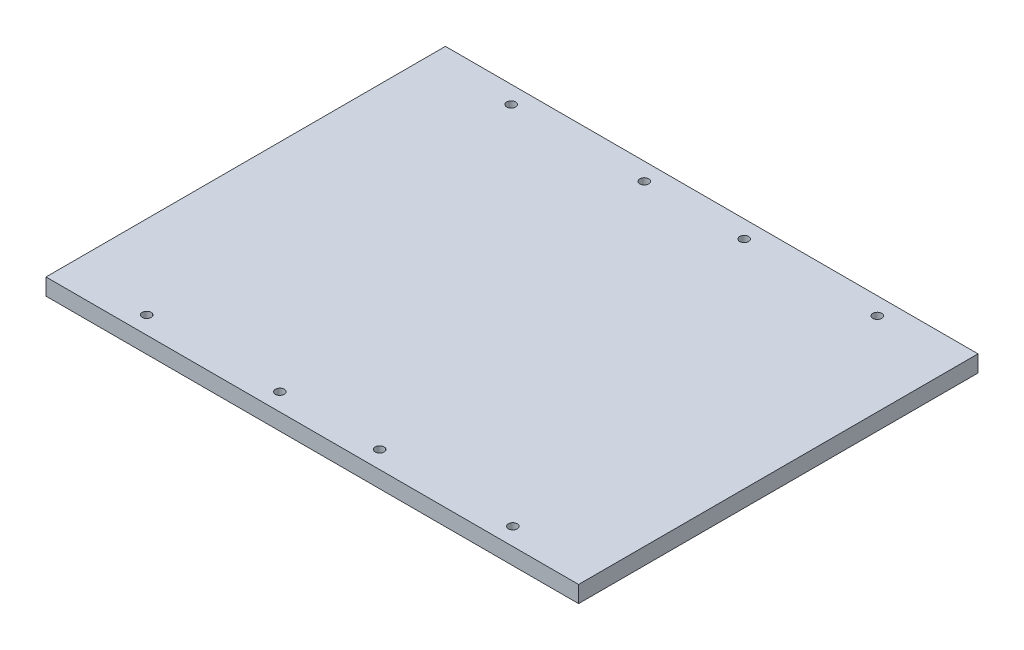
ISO-10303-21;
HEADER;
FILE_DESCRIPTION(('STEP AP214'),'2;1');
FILE_NAME('part.step','',(''),(''),'','','');
FILE_SCHEMA(('AUTOMOTIVE_DESIGN { 1 0 10303 214 1 1 1 1 }'));
ENDSEC;
DATA;
#1=APPLICATION_CONTEXT('core data for automotive mechanical design processes');
#2=APPLICATION_PROTOCOL_DEFINITION('international standard','automotive_design',2000,#1);
#3=PRODUCT_CONTEXT('',#1,'mechanical');
#4=PRODUCT('Part','Part','',(#3));
#5=PRODUCT_RELATED_PRODUCT_CATEGORY('part','',(#4));
#6=PRODUCT_DEFINITION_FORMATION('','',#4);
#7=PRODUCT_DEFINITION_CONTEXT('part definition',#1,'design');
#8=PRODUCT_DEFINITION('design','',#6,#7);
#9=PRODUCT_DEFINITION_SHAPE('','',#8);
#10=(LENGTH_UNIT() NAMED_UNIT(*) SI_UNIT(.MILLI.,.METRE.));
#11=(NAMED_UNIT(*) PLANE_ANGLE_UNIT() SI_UNIT($,.RADIAN.));
#12=(NAMED_UNIT(*) SI_UNIT($,.STERADIAN.) SOLID_ANGLE_UNIT());
#13=UNCERTAINTY_MEASURE_WITH_UNIT(LENGTH_MEASURE(1.E-05),#10,'distance_accuracy_value','');
#14=(GEOMETRIC_REPRESENTATION_CONTEXT(3) GLOBAL_UNCERTAINTY_ASSIGNED_CONTEXT((#13)) GLOBAL_UNIT_ASSIGNED_CONTEXT((#10,
#11,#12)) REPRESENTATION_CONTEXT('',''));
#15=CARTESIAN_POINT('',(0.,0.,0.));
#16=DIRECTION('',(0.,0.,1.));
#17=DIRECTION('',(1.,0.,0.));
#18=AXIS2_PLACEMENT_3D('',#15,#16,#17);
#19=CARTESIAN_POINT('',(0.,6.35,0.));
#20=DIRECTION('',(0.,1.,0.));
#21=DIRECTION('',(0.,0.,1.));
#22=AXIS2_PLACEMENT_3D('',#19,#20,#21);
#23=PLANE('',#22);
#24=CARTESIAN_POINT('',(19.0499999999987,6.35,69.5325));
#25=DIRECTION('',(0.,1.,0.));
#26=DIRECTION('',(0.,0.,-1.));
#27=AXIS2_PLACEMENT_3D('',#24,#25,#26);
#28=CIRCLE('',#27,1.70000000000061);
#29=CARTESIAN_POINT('',(19.0499999999987,6.35,67.8324999999994));
#30=VERTEX_POINT('',#29);
#31=EDGE_CURVE('E145',#30,#30,#28,.T.);
#32=ORIENTED_EDGE('',*,*,#31,.F.);
#33=EDGE_LOOP('',(#32));
#34=FACE_BOUND('',#33,.T.);
#35=CARTESIAN_POINT('',(-69.8500000000013,6.35,69.5325));
#36=DIRECTION('',(0.,1.,0.));
#37=DIRECTION('',(0.,0.,-1.));
#38=AXIS2_PLACEMENT_3D('',#35,#36,#37);
#39=CIRCLE('',#38,1.7000000000006);
#40=CARTESIAN_POINT('',(-69.8500000000013,6.35,67.8324999999994));
#41=VERTEX_POINT('',#40);
#42=EDGE_CURVE('E133',#41,#41,#39,.T.);
#43=ORIENTED_EDGE('',*,*,#42,.F.);
#44=EDGE_LOOP('',(#43));
#45=FACE_BOUND('',#44,.T.);
#46=CARTESIAN_POINT('',(19.0499999999987,6.35,-69.5325));
#47=DIRECTION('',(0.,1.,0.));
#48=DIRECTION('',(0.,0.,1.));
#49=AXIS2_PLACEMENT_3D('',#46,#47,#48);
#50=CIRCLE('',#49,1.70000000000061);
#51=CARTESIAN_POINT('',(19.0499999999987,6.35,-67.8324999999994));
#52=VERTEX_POINT('',#51);
#53=EDGE_CURVE('E121',#52,#52,#50,.T.);
#54=ORIENTED_EDGE('',*,*,#53,.F.);
#55=EDGE_LOOP('',(#54));
#56=FACE_BOUND('',#55,.T.);
#57=CARTESIAN_POINT('',(-69.8500000000013,6.35,-69.5325));
#58=DIRECTION('',(0.,1.,0.));
#59=DIRECTION('',(0.,0.,1.));
#60=AXIS2_PLACEMENT_3D('',#57,#58,#59);
#61=CIRCLE('',#60,1.7000000000006);
#62=CARTESIAN_POINT('',(-69.8500000000013,6.35,-67.8324999999994));
#63=VERTEX_POINT('',#62);
#64=EDGE_CURVE('E100',#63,#63,#61,.T.);
#65=ORIENTED_EDGE('',*,*,#64,.F.);
#66=EDGE_LOOP('',(#65));
#67=FACE_BOUND('',#66,.T.);
#68=DIRECTION('',(0.,0.,1.));
#69=VECTOR('',#68,1.);
#70=CARTESIAN_POINT('',(-101.599999999999,6.35,76.2));
#71=LINE('',#70,#69);
#72=CARTESIAN_POINT('',(-101.599999999999,6.35,-76.2));
#73=VERTEX_POINT('',#72);
#74=CARTESIAN_POINT('',(-101.599999999999,6.35,76.2));
#75=VERTEX_POINT('',#74);
#76=EDGE_CURVE('E85',#73,#75,#71,.T.);
#77=ORIENTED_EDGE('',*,*,#76,.T.);
#78=DIRECTION('',(1.,0.,0.));
#79=VECTOR('',#78,1.);
#80=CARTESIAN_POINT('',(101.600000000001,6.35,76.2));
#81=LINE('',#80,#79);
#82=CARTESIAN_POINT('',(101.600000000001,6.35,76.2));
#83=VERTEX_POINT('',#82);
#84=EDGE_CURVE('E80',#75,#83,#81,.T.);
#85=ORIENTED_EDGE('',*,*,#84,.T.);
#86=DIRECTION('',(0.,0.,-1.));
#87=VECTOR('',#86,1.);
#88=CARTESIAN_POINT('',(101.600000000001,6.35,76.2));
#89=LINE('',#88,#87);
#90=CARTESIAN_POINT('',(101.600000000001,6.35,-76.2));
#91=VERTEX_POINT('',#90);
#92=EDGE_CURVE('E83',#83,#91,#89,.T.);
#93=ORIENTED_EDGE('',*,*,#92,.T.);
#94=DIRECTION('',(-1.,0.,0.));
#95=VECTOR('',#94,1.);
#96=CARTESIAN_POINT('',(101.600000000001,6.35,-76.2));
#97=LINE('',#96,#95);
#98=EDGE_CURVE('E50',#91,#73,#97,.T.);
#99=ORIENTED_EDGE('',*,*,#98,.T.);
#100=EDGE_LOOP('',(#77,#85,#93,#99));
#101=FACE_BOUND('',#100,.T.);
#102=CARTESIAN_POINT('',(-19.0500000000013,6.35,-69.5325));
#103=DIRECTION('',(0.,1.,0.));
#104=DIRECTION('',(0.,0.,1.));
#105=AXIS2_PLACEMENT_3D('',#102,#103,#104);
#106=CIRCLE('',#105,1.70000000000061);
#107=CARTESIAN_POINT('',(-19.0500000000013,6.35,-67.8324999999994));
#108=VERTEX_POINT('',#107);
#109=EDGE_CURVE('E115',#108,#108,#106,.T.);
#110=ORIENTED_EDGE('',*,*,#109,.F.);
#111=EDGE_LOOP('',(#110));
#112=FACE_BOUND('',#111,.T.);
#113=CARTESIAN_POINT('',(69.8499999999987,6.35,-69.5325));
#114=DIRECTION('',(0.,1.,0.));
#115=DIRECTION('',(0.,0.,1.));
#116=AXIS2_PLACEMENT_3D('',#113,#114,#115);
#117=CIRCLE('',#116,1.7000000000006);
#118=CARTESIAN_POINT('',(69.8499999999987,6.35,-67.8324999999994));
#119=VERTEX_POINT('',#118);
#120=EDGE_CURVE('E127',#119,#119,#117,.T.);
#121=ORIENTED_EDGE('',*,*,#120,.F.);
#122=EDGE_LOOP('',(#121));
#123=FACE_BOUND('',#122,.T.);
#124=CARTESIAN_POINT('',(69.8499999999987,6.35,69.5325));
#125=DIRECTION('',(0.,1.,0.));
#126=DIRECTION('',(0.,0.,-1.));
#127=AXIS2_PLACEMENT_3D('',#124,#125,#126);
#128=CIRCLE('',#127,1.70000000000061);
#129=CARTESIAN_POINT('',(69.8499999999987,6.35,67.8324999999994));
#130=VERTEX_POINT('',#129);
#131=EDGE_CURVE('E139',#130,#130,#128,.T.);
#132=ORIENTED_EDGE('',*,*,#131,.F.);
#133=EDGE_LOOP('',(#132));
#134=FACE_BOUND('',#133,.T.);
#135=CARTESIAN_POINT('',(-19.0500000000013,6.35,69.5325));
#136=DIRECTION('',(0.,1.,0.));
#137=DIRECTION('',(0.,0.,-1.));
#138=AXIS2_PLACEMENT_3D('',#135,#136,#137);
#139=CIRCLE('',#138,1.70000000000061);
#140=CARTESIAN_POINT('',(-19.0500000000013,6.35,67.8324999999994));
#141=VERTEX_POINT('',#140);
#142=EDGE_CURVE('E151',#141,#141,#139,.T.);
#143=ORIENTED_EDGE('',*,*,#142,.F.);
#144=EDGE_LOOP('',(#143));
#145=FACE_BOUND('',#144,.T.);
#146=ADVANCED_FACE('F33',(#34,#45,#56,#67,#101,#112,#123,#134,#145),#23,.T.);
#147=CARTESIAN_POINT('',(0.,0.,0.));
#148=DIRECTION('',(0.,1.,0.));
#149=DIRECTION('',(0.,0.,1.));
#150=AXIS2_PLACEMENT_3D('',#147,#148,#149);
#151=PLANE('',#150);
#152=CARTESIAN_POINT('',(19.0499999999987,0.,69.5325));
#153=DIRECTION('',(0.,1.,0.));
#154=DIRECTION('',(0.,0.,-1.));
#155=AXIS2_PLACEMENT_3D('',#152,#153,#154);
#156=CIRCLE('',#155,1.70000000000061);
#157=CARTESIAN_POINT('',(19.0499999999987,0.,67.8324999999994));
#158=VERTEX_POINT('',#157);
#159=EDGE_CURVE('E148',#158,#158,#156,.T.);
#160=ORIENTED_EDGE('',*,*,#159,.T.);
#161=EDGE_LOOP('',(#160));
#162=FACE_BOUND('',#161,.T.);
#163=CARTESIAN_POINT('',(-69.8500000000013,0.,69.5325));
#164=DIRECTION('',(0.,1.,0.));
#165=DIRECTION('',(0.,0.,-1.));
#166=AXIS2_PLACEMENT_3D('',#163,#164,#165);
#167=CIRCLE('',#166,1.7000000000006);
#168=CARTESIAN_POINT('',(-69.8500000000013,0.,67.8324999999994));
#169=VERTEX_POINT('',#168);
#170=EDGE_CURVE('E136',#169,#169,#167,.T.);
#171=ORIENTED_EDGE('',*,*,#170,.T.);
#172=EDGE_LOOP('',(#171));
#173=FACE_BOUND('',#172,.T.);
#174=CARTESIAN_POINT('',(19.0499999999987,0.,-69.5325));
#175=DIRECTION('',(0.,1.,0.));
#176=DIRECTION('',(0.,0.,1.));
#177=AXIS2_PLACEMENT_3D('',#174,#175,#176);
#178=CIRCLE('',#177,1.70000000000061);
#179=CARTESIAN_POINT('',(19.0499999999987,0.,-67.8324999999994));
#180=VERTEX_POINT('',#179);
#181=EDGE_CURVE('E124',#180,#180,#178,.T.);
#182=ORIENTED_EDGE('',*,*,#181,.T.);
#183=EDGE_LOOP('',(#182));
#184=FACE_BOUND('',#183,.T.);
#185=CARTESIAN_POINT('',(-69.8500000000013,0.,-69.5325));
#186=DIRECTION('',(0.,1.,0.));
#187=DIRECTION('',(0.,0.,1.));
#188=AXIS2_PLACEMENT_3D('',#185,#186,#187);
#189=CIRCLE('',#188,1.7000000000006);
#190=CARTESIAN_POINT('',(-69.8500000000013,0.,-67.8324999999994));
#191=VERTEX_POINT('',#190);
#192=EDGE_CURVE('E112',#191,#191,#189,.T.);
#193=ORIENTED_EDGE('',*,*,#192,.T.);
#194=EDGE_LOOP('',(#193));
#195=FACE_BOUND('',#194,.T.);
#196=DIRECTION('',(0.,0.,1.));
#197=VECTOR('',#196,1.);
#198=CARTESIAN_POINT('',(-101.599999999999,0.,76.2));
#199=LINE('',#198,#197);
#200=CARTESIAN_POINT('',(-101.599999999999,0.,-76.2));
#201=VERTEX_POINT('',#200);
#202=CARTESIAN_POINT('',(-101.599999999999,0.,76.2));
#203=VERTEX_POINT('',#202);
#204=EDGE_CURVE('E97',#201,#203,#199,.T.);
#205=ORIENTED_EDGE('',*,*,#204,.F.);
#206=DIRECTION('',(-1.,0.,0.));
#207=VECTOR('',#206,1.);
#208=CARTESIAN_POINT('',(101.600000000001,0.,-76.2));
#209=LINE('',#208,#207);
#210=CARTESIAN_POINT('',(101.600000000001,0.,-76.2));
#211=VERTEX_POINT('',#210);
#212=EDGE_CURVE('E73',#211,#201,#209,.T.);
#213=ORIENTED_EDGE('',*,*,#212,.F.);
#214=DIRECTION('',(0.,0.,-1.));
#215=VECTOR('',#214,1.);
#216=CARTESIAN_POINT('',(101.600000000001,0.,76.2));
#217=LINE('',#216,#215);
#218=CARTESIAN_POINT('',(101.600000000001,0.,76.2));
#219=VERTEX_POINT('',#218);
#220=EDGE_CURVE('E67',#219,#211,#217,.T.);
#221=ORIENTED_EDGE('',*,*,#220,.F.);
#222=DIRECTION('',(1.,0.,0.));
#223=VECTOR('',#222,1.);
#224=CARTESIAN_POINT('',(101.600000000001,0.,76.2));
#225=LINE('',#224,#223);
#226=EDGE_CURVE('E89',#203,#219,#225,.T.);
#227=ORIENTED_EDGE('',*,*,#226,.F.);
#228=EDGE_LOOP('',(#205,#213,#221,#227));
#229=FACE_BOUND('',#228,.T.);
#230=CARTESIAN_POINT('',(-19.0500000000013,0.,-69.5325));
#231=DIRECTION('',(0.,1.,0.));
#232=DIRECTION('',(0.,0.,1.));
#233=AXIS2_PLACEMENT_3D('',#230,#231,#232);
#234=CIRCLE('',#233,1.70000000000061);
#235=CARTESIAN_POINT('',(-19.0500000000013,0.,-67.8324999999994));
#236=VERTEX_POINT('',#235);
#237=EDGE_CURVE('E118',#236,#236,#234,.T.);
#238=ORIENTED_EDGE('',*,*,#237,.T.);
#239=EDGE_LOOP('',(#238));
#240=FACE_BOUND('',#239,.T.);
#241=CARTESIAN_POINT('',(69.8499999999987,0.,-69.5325));
#242=DIRECTION('',(0.,1.,0.));
#243=DIRECTION('',(0.,0.,1.));
#244=AXIS2_PLACEMENT_3D('',#241,#242,#243);
#245=CIRCLE('',#244,1.7000000000006);
#246=CARTESIAN_POINT('',(69.8499999999987,0.,-67.8324999999994));
#247=VERTEX_POINT('',#246);
#248=EDGE_CURVE('E130',#247,#247,#245,.T.);
#249=ORIENTED_EDGE('',*,*,#248,.T.);
#250=EDGE_LOOP('',(#249));
#251=FACE_BOUND('',#250,.T.);
#252=CARTESIAN_POINT('',(69.8499999999987,0.,69.5325));
#253=DIRECTION('',(0.,1.,0.));
#254=DIRECTION('',(0.,0.,-1.));
#255=AXIS2_PLACEMENT_3D('',#252,#253,#254);
#256=CIRCLE('',#255,1.70000000000061);
#257=CARTESIAN_POINT('',(69.8499999999987,0.,67.8324999999994));
#258=VERTEX_POINT('',#257);
#259=EDGE_CURVE('E142',#258,#258,#256,.T.);
#260=ORIENTED_EDGE('',*,*,#259,.T.);
#261=EDGE_LOOP('',(#260));
#262=FACE_BOUND('',#261,.T.);
#263=CARTESIAN_POINT('',(-19.0500000000013,0.,69.5325));
#264=DIRECTION('',(0.,1.,0.));
#265=DIRECTION('',(0.,0.,-1.));
#266=AXIS2_PLACEMENT_3D('',#263,#264,#265);
#267=CIRCLE('',#266,1.70000000000061);
#268=CARTESIAN_POINT('',(-19.0500000000013,0.,67.8324999999994));
#269=VERTEX_POINT('',#268);
#270=EDGE_CURVE('E154',#269,#269,#267,.T.);
#271=ORIENTED_EDGE('',*,*,#270,.T.);
#272=EDGE_LOOP('',(#271));
#273=FACE_BOUND('',#272,.T.);
#274=ADVANCED_FACE('F108',(#162,#173,#184,#195,#229,#240,#251,#262,#273),#151,.F.);
#275=CARTESIAN_POINT('',(-101.599999999999,6.35,76.2));
#276=DIRECTION('',(1.,0.,0.));
#277=DIRECTION('',(0.,0.,-1.));
#278=AXIS2_PLACEMENT_3D('',#275,#276,#277);
#279=PLANE('',#278);
#280=ORIENTED_EDGE('',*,*,#204,.T.);
#281=DIRECTION('',(0.,-1.,0.));
#282=VECTOR('',#281,1.);
#283=CARTESIAN_POINT('',(-101.599999999999,6.35,76.2));
#284=LINE('',#283,#282);
#285=EDGE_CURVE('E11',#75,#203,#284,.T.);
#286=ORIENTED_EDGE('',*,*,#285,.F.);
#287=ORIENTED_EDGE('',*,*,#76,.F.);
#288=DIRECTION('',(0.,-1.,0.));
#289=VECTOR('',#288,1.);
#290=CARTESIAN_POINT('',(-101.599999999999,6.35,-76.2));
#291=LINE('',#290,#289);
#292=EDGE_CURVE('E93',#73,#201,#291,.T.);
#293=ORIENTED_EDGE('',*,*,#292,.T.);
#294=EDGE_LOOP('',(#280,#286,#287,#293));
#295=FACE_BOUND('',#294,.T.);
#296=ADVANCED_FACE('F35',(#295),#279,.F.);
#297=CARTESIAN_POINT('',(101.600000000001,6.35,76.2));
#298=DIRECTION('',(0.,0.,-1.));
#299=DIRECTION('',(-1.,0.,0.));
#300=AXIS2_PLACEMENT_3D('',#297,#298,#299);
#301=PLANE('',#300);
#302=ORIENTED_EDGE('',*,*,#226,.T.);
#303=DIRECTION('',(0.,-1.,0.));
#304=VECTOR('',#303,1.);
#305=CARTESIAN_POINT('',(101.600000000001,6.35,76.2));
#306=LINE('',#305,#304);
#307=EDGE_CURVE('E42',#83,#219,#306,.T.);
#308=ORIENTED_EDGE('',*,*,#307,.F.);
#309=ORIENTED_EDGE('',*,*,#84,.F.);
#310=ORIENTED_EDGE('',*,*,#285,.T.);
#311=EDGE_LOOP('',(#302,#308,#309,#310));
#312=FACE_BOUND('',#311,.T.);
#313=ADVANCED_FACE('F88',(#312),#301,.F.);
#314=CARTESIAN_POINT('',(101.600000000001,6.35,76.2));
#315=DIRECTION('',(-1.,0.,0.));
#316=DIRECTION('',(0.,0.,1.));
#317=AXIS2_PLACEMENT_3D('',#314,#315,#316);
#318=PLANE('',#317);
#319=ORIENTED_EDGE('',*,*,#220,.T.);
#320=DIRECTION('',(0.,-1.,0.));
#321=VECTOR('',#320,1.);
#322=CARTESIAN_POINT('',(101.600000000001,6.35,-76.2));
#323=LINE('',#322,#321);
#324=EDGE_CURVE('E90',#91,#211,#323,.T.);
#325=ORIENTED_EDGE('',*,*,#324,.F.);
#326=ORIENTED_EDGE('',*,*,#92,.F.);
#327=ORIENTED_EDGE('',*,*,#307,.T.);
#328=EDGE_LOOP('',(#319,#325,#326,#327));
#329=FACE_BOUND('',#328,.T.);
#330=ADVANCED_FACE('F91',(#329),#318,.F.);
#331=CARTESIAN_POINT('',(101.600000000001,6.35,-76.2));
#332=DIRECTION('',(0.,0.,1.));
#333=DIRECTION('',(1.,0.,0.));
#334=AXIS2_PLACEMENT_3D('',#331,#332,#333);
#335=PLANE('',#334);
#336=ORIENTED_EDGE('',*,*,#212,.T.);
#337=ORIENTED_EDGE('',*,*,#292,.F.);
#338=ORIENTED_EDGE('',*,*,#98,.F.);
#339=ORIENTED_EDGE('',*,*,#324,.T.);
#340=EDGE_LOOP('',(#336,#337,#338,#339));
#341=FACE_BOUND('',#340,.T.);
#342=ADVANCED_FACE('F105',(#341),#335,.F.);
#343=CARTESIAN_POINT('',(-69.8500000000013,6.35,-69.5325));
#344=DIRECTION('',(0.,-1.,0.));
#345=DIRECTION('',(0.,0.,-1.));
#346=AXIS2_PLACEMENT_3D('',#343,#344,#345);
#347=CYLINDRICAL_SURFACE('',#346,1.7000000000006);
#348=ORIENTED_EDGE('',*,*,#64,.T.);
#349=EDGE_LOOP('',(#348));
#350=FACE_BOUND('',#349,.T.);
#351=ORIENTED_EDGE('',*,*,#192,.F.);
#352=EDGE_LOOP('',(#351));
#353=FACE_BOUND('',#352,.T.);
#354=ADVANCED_FACE('F174',(#350,#353),#347,.F.);
#355=CARTESIAN_POINT('',(-19.0500000000013,6.35,-69.5325));
#356=DIRECTION('',(0.,-1.,0.));
#357=DIRECTION('',(0.,0.,-1.));
#358=AXIS2_PLACEMENT_3D('',#355,#356,#357);
#359=CYLINDRICAL_SURFACE('',#358,1.70000000000061);
#360=ORIENTED_EDGE('',*,*,#109,.T.);
#361=EDGE_LOOP('',(#360));
#362=FACE_BOUND('',#361,.T.);
#363=ORIENTED_EDGE('',*,*,#237,.F.);
#364=EDGE_LOOP('',(#363));
#365=FACE_BOUND('',#364,.T.);
#366=ADVANCED_FACE('F220',(#362,#365),#359,.F.);
#367=CARTESIAN_POINT('',(19.0499999999987,6.35,-69.5325));
#368=DIRECTION('',(0.,-1.,0.));
#369=DIRECTION('',(0.,0.,-1.));
#370=AXIS2_PLACEMENT_3D('',#367,#368,#369);
#371=CYLINDRICAL_SURFACE('',#370,1.70000000000061);
#372=ORIENTED_EDGE('',*,*,#53,.T.);
#373=EDGE_LOOP('',(#372));
#374=FACE_BOUND('',#373,.T.);
#375=ORIENTED_EDGE('',*,*,#181,.F.);
#376=EDGE_LOOP('',(#375));
#377=FACE_BOUND('',#376,.T.);
#378=ADVANCED_FACE('F228',(#374,#377),#371,.F.);
#379=CARTESIAN_POINT('',(69.8499999999987,6.35,-69.5325));
#380=DIRECTION('',(0.,-1.,0.));
#381=DIRECTION('',(0.,0.,-1.));
#382=AXIS2_PLACEMENT_3D('',#379,#380,#381);
#383=CYLINDRICAL_SURFACE('',#382,1.7000000000006);
#384=ORIENTED_EDGE('',*,*,#120,.T.);
#385=EDGE_LOOP('',(#384));
#386=FACE_BOUND('',#385,.T.);
#387=ORIENTED_EDGE('',*,*,#248,.F.);
#388=EDGE_LOOP('',(#387));
#389=FACE_BOUND('',#388,.T.);
#390=ADVANCED_FACE('F236',(#386,#389),#383,.F.);
#391=CARTESIAN_POINT('',(-69.8500000000013,6.35,69.5325));
#392=DIRECTION('',(0.,-1.,0.));
#393=DIRECTION('',(0.,0.,-1.));
#394=AXIS2_PLACEMENT_3D('',#391,#392,#393);
#395=CYLINDRICAL_SURFACE('',#394,1.7000000000006);
#396=ORIENTED_EDGE('',*,*,#42,.T.);
#397=EDGE_LOOP('',(#396));
#398=FACE_BOUND('',#397,.T.);
#399=ORIENTED_EDGE('',*,*,#170,.F.);
#400=EDGE_LOOP('',(#399));
#401=FACE_BOUND('',#400,.T.);
#402=ADVANCED_FACE('F245',(#398,#401),#395,.F.);
#403=CARTESIAN_POINT('',(69.8499999999987,6.35,69.5325));
#404=DIRECTION('',(0.,-1.,0.));
#405=DIRECTION('',(0.,0.,-1.));
#406=AXIS2_PLACEMENT_3D('',#403,#404,#405);
#407=CYLINDRICAL_SURFACE('',#406,1.70000000000061);
#408=ORIENTED_EDGE('',*,*,#131,.T.);
#409=EDGE_LOOP('',(#408));
#410=FACE_BOUND('',#409,.T.);
#411=ORIENTED_EDGE('',*,*,#259,.F.);
#412=EDGE_LOOP('',(#411));
#413=FACE_BOUND('',#412,.T.);
#414=ADVANCED_FACE('F254',(#410,#413),#407,.F.);
#415=CARTESIAN_POINT('',(19.0499999999987,6.35,69.5325));
#416=DIRECTION('',(0.,-1.,0.));
#417=DIRECTION('',(0.,0.,-1.));
#418=AXIS2_PLACEMENT_3D('',#415,#416,#417);
#419=CYLINDRICAL_SURFACE('',#418,1.70000000000061);
#420=ORIENTED_EDGE('',*,*,#31,.T.);
#421=EDGE_LOOP('',(#420));
#422=FACE_BOUND('',#421,.T.);
#423=ORIENTED_EDGE('',*,*,#159,.F.);
#424=EDGE_LOOP('',(#423));
#425=FACE_BOUND('',#424,.T.);
#426=ADVANCED_FACE('F263',(#422,#425),#419,.F.);
#427=CARTESIAN_POINT('',(-19.0500000000013,6.35,69.5325));
#428=DIRECTION('',(0.,-1.,0.));
#429=DIRECTION('',(0.,0.,-1.));
#430=AXIS2_PLACEMENT_3D('',#427,#428,#429);
#431=CYLINDRICAL_SURFACE('',#430,1.70000000000061);
#432=ORIENTED_EDGE('',*,*,#142,.T.);
#433=EDGE_LOOP('',(#432));
#434=FACE_BOUND('',#433,.T.);
#435=ORIENTED_EDGE('',*,*,#270,.F.);
#436=EDGE_LOOP('',(#435));
#437=FACE_BOUND('',#436,.T.);
#438=ADVANCED_FACE('F160',(#434,#437),#431,.F.);
#439=CLOSED_SHELL('',(#146,#274,#296,#313,#330,#342,#354,#366,#378,#390,#402,#414,#426,#438));
#440=MANIFOLD_SOLID_BREP('B2',#439);
#441=ADVANCED_BREP_SHAPE_REPRESENTATION('',(#18,#440),#14);
#442=SHAPE_DEFINITION_REPRESENTATION(#9,#441);
ENDSEC;
END-ISO-10303-21;
